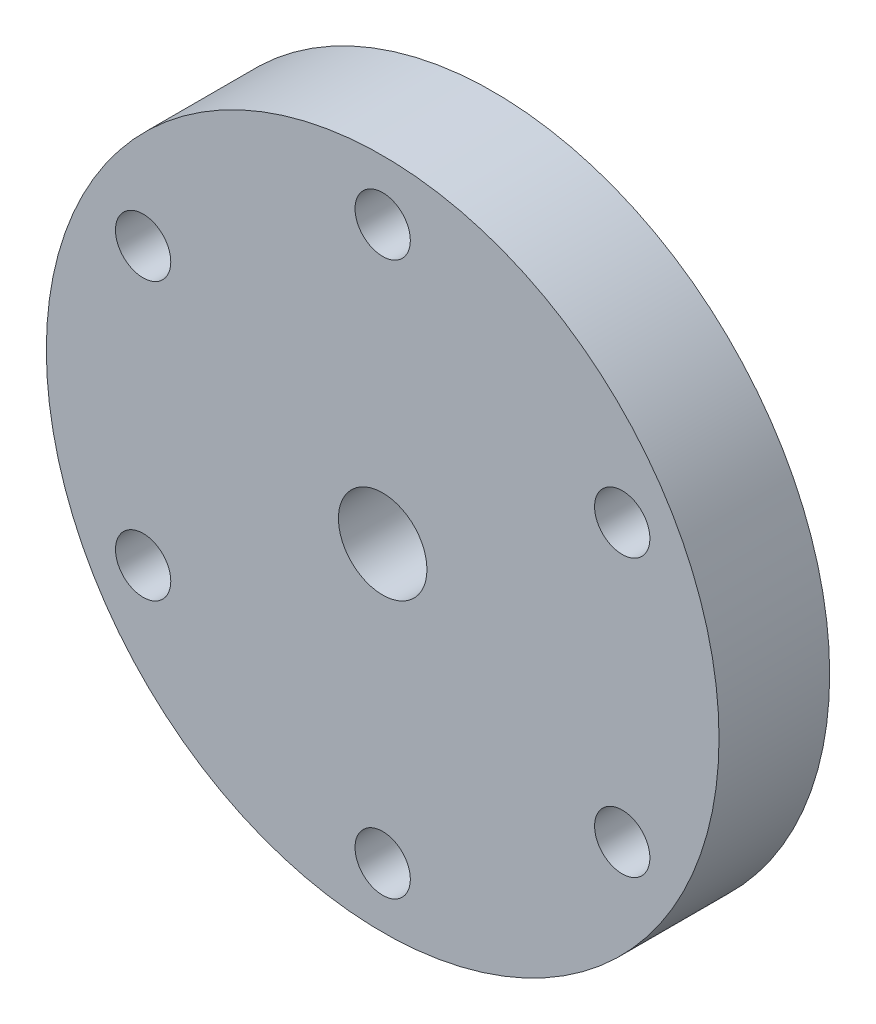
ISO-10303-21;
HEADER;
FILE_DESCRIPTION(('STEP AP214'),'2;1');
FILE_NAME('part.step','',(''),(''),'','','');
FILE_SCHEMA(('AUTOMOTIVE_DESIGN { 1 0 10303 214 1 1 1 1 }'));
ENDSEC;
DATA;
#1=APPLICATION_CONTEXT('core data for automotive mechanical design processes');
#2=APPLICATION_PROTOCOL_DEFINITION('international standard','automotive_design',2000,#1);
#3=PRODUCT_CONTEXT('',#1,'mechanical');
#4=PRODUCT('Part','Part','',(#3));
#5=PRODUCT_RELATED_PRODUCT_CATEGORY('part','',(#4));
#6=PRODUCT_DEFINITION_FORMATION('','',#4);
#7=PRODUCT_DEFINITION_CONTEXT('part definition',#1,'design');
#8=PRODUCT_DEFINITION('design','',#6,#7);
#9=PRODUCT_DEFINITION_SHAPE('','',#8);
#10=(LENGTH_UNIT() NAMED_UNIT(*) SI_UNIT(.MILLI.,.METRE.));
#11=(NAMED_UNIT(*) PLANE_ANGLE_UNIT() SI_UNIT($,.RADIAN.));
#12=(NAMED_UNIT(*) SI_UNIT($,.STERADIAN.) SOLID_ANGLE_UNIT());
#13=UNCERTAINTY_MEASURE_WITH_UNIT(LENGTH_MEASURE(1.E-05),#10,'distance_accuracy_value','');
#14=(GEOMETRIC_REPRESENTATION_CONTEXT(3) GLOBAL_UNCERTAINTY_ASSIGNED_CONTEXT((#13)) GLOBAL_UNIT_ASSIGNED_CONTEXT((#10,
#11,#12)) REPRESENTATION_CONTEXT('',''));
#15=CARTESIAN_POINT('',(0.,0.,0.));
#16=DIRECTION('',(0.,0.,1.));
#17=DIRECTION('',(1.,0.,0.));
#18=AXIS2_PLACEMENT_3D('',#15,#16,#17);
#19=CARTESIAN_POINT('',(0.,0.,5.));
#20=DIRECTION('',(0.,0.,-1.));
#21=DIRECTION('',(-1.,0.,0.));
#22=AXIS2_PLACEMENT_3D('',#19,#20,#21);
#23=CYLINDRICAL_SURFACE('',#22,15.2);
#24=CARTESIAN_POINT('',(0.,0.,5.));
#25=DIRECTION('',(0.,0.,1.));
#26=DIRECTION('',(1.,0.,0.));
#27=AXIS2_PLACEMENT_3D('',#24,#25,#26);
#28=CIRCLE('',#27,15.2);
#29=CARTESIAN_POINT('',(15.2,0.,5.));
#30=VERTEX_POINT('',#29);
#31=EDGE_CURVE('E10',#30,#30,#28,.T.);
#32=ORIENTED_EDGE('',*,*,#31,.F.);
#33=EDGE_LOOP('',(#32));
#34=FACE_BOUND('',#33,.T.);
#35=CARTESIAN_POINT('',(0.,0.,0.));
#36=DIRECTION('',(0.,0.,1.));
#37=DIRECTION('',(1.,0.,0.));
#38=AXIS2_PLACEMENT_3D('',#35,#36,#37);
#39=CIRCLE('',#38,15.2);
#40=CARTESIAN_POINT('',(15.2,0.,0.));
#41=VERTEX_POINT('',#40);
#42=EDGE_CURVE('E50',#41,#41,#39,.T.);
#43=ORIENTED_EDGE('',*,*,#42,.T.);
#44=EDGE_LOOP('',(#43));
#45=FACE_BOUND('',#44,.T.);
#46=ADVANCED_FACE('F47',(#34,#45),#23,.T.);
#47=CARTESIAN_POINT('',(0.,0.,5.));
#48=DIRECTION('',(0.,0.,1.));
#49=DIRECTION('',(1.,0.,0.));
#50=AXIS2_PLACEMENT_3D('',#47,#48,#49);
#51=PLANE('',#50);
#52=CARTESIAN_POINT('',(0.,0.,5.));
#53=DIRECTION('',(0.,0.,1.));
#54=DIRECTION('',(1.,0.,0.));
#55=AXIS2_PLACEMENT_3D('',#52,#53,#54);
#56=CIRCLE('',#55,2.);
#57=CARTESIAN_POINT('',(2.,0.,5.));
#58=VERTEX_POINT('',#57);
#59=EDGE_CURVE('E106',#58,#58,#56,.T.);
#60=ORIENTED_EDGE('',*,*,#59,.F.);
#61=EDGE_LOOP('',(#60));
#62=FACE_BOUND('',#61,.T.);
#63=CARTESIAN_POINT('',(0.,12.5,5.));
#64=DIRECTION('',(0.,0.,1.));
#65=DIRECTION('',(1.,0.,0.));
#66=AXIS2_PLACEMENT_3D('',#63,#64,#65);
#67=CIRCLE('',#66,1.25);
#68=CARTESIAN_POINT('',(1.25,12.5,5.));
#69=VERTEX_POINT('',#68);
#70=EDGE_CURVE('E61',#69,#69,#67,.T.);
#71=ORIENTED_EDGE('',*,*,#70,.F.);
#72=EDGE_LOOP('',(#71));
#73=FACE_BOUND('',#72,.T.);
#74=CARTESIAN_POINT('',(-10.8253175473055,6.25,5.));
#75=DIRECTION('',(0.,0.,1.));
#76=DIRECTION('',(1.,0.,0.));
#77=AXIS2_PLACEMENT_3D('',#74,#75,#76);
#78=CIRCLE('',#77,1.25);
#79=CARTESIAN_POINT('',(-9.57531754730548,6.25,5.));
#80=VERTEX_POINT('',#79);
#81=EDGE_CURVE('E66',#80,#80,#78,.T.);
#82=ORIENTED_EDGE('',*,*,#81,.F.);
#83=EDGE_LOOP('',(#82));
#84=FACE_BOUND('',#83,.T.);
#85=CARTESIAN_POINT('',(-10.8253175473055,-6.25000000000001,5.));
#86=DIRECTION('',(0.,0.,1.));
#87=DIRECTION('',(1.,0.,0.));
#88=AXIS2_PLACEMENT_3D('',#85,#86,#87);
#89=CIRCLE('',#88,1.25);
#90=CARTESIAN_POINT('',(-9.57531754730548,-6.25000000000001,5.));
#91=VERTEX_POINT('',#90);
#92=EDGE_CURVE('E70',#91,#91,#89,.T.);
#93=ORIENTED_EDGE('',*,*,#92,.F.);
#94=EDGE_LOOP('',(#93));
#95=FACE_BOUND('',#94,.T.);
#96=CARTESIAN_POINT('',(0.,-12.5,5.));
#97=DIRECTION('',(0.,0.,1.));
#98=DIRECTION('',(1.,0.,0.));
#99=AXIS2_PLACEMENT_3D('',#96,#97,#98);
#100=CIRCLE('',#99,1.25);
#101=CARTESIAN_POINT('',(1.25,-12.5,5.));
#102=VERTEX_POINT('',#101);
#103=EDGE_CURVE('E73',#102,#102,#100,.T.);
#104=ORIENTED_EDGE('',*,*,#103,.F.);
#105=EDGE_LOOP('',(#104));
#106=FACE_BOUND('',#105,.T.);
#107=CARTESIAN_POINT('',(10.8253175473055,-6.25,5.));
#108=DIRECTION('',(0.,0.,1.));
#109=DIRECTION('',(1.,0.,0.));
#110=AXIS2_PLACEMENT_3D('',#107,#108,#109);
#111=CIRCLE('',#110,1.25);
#112=CARTESIAN_POINT('',(12.0753175473055,-6.25,5.));
#113=VERTEX_POINT('',#112);
#114=EDGE_CURVE('E77',#113,#113,#111,.T.);
#115=ORIENTED_EDGE('',*,*,#114,.F.);
#116=EDGE_LOOP('',(#115));
#117=FACE_BOUND('',#116,.T.);
#118=CARTESIAN_POINT('',(10.8253175473055,6.25,5.));
#119=DIRECTION('',(0.,0.,1.));
#120=DIRECTION('',(1.,0.,0.));
#121=AXIS2_PLACEMENT_3D('',#118,#119,#120);
#122=CIRCLE('',#121,1.25);
#123=CARTESIAN_POINT('',(12.0753175473055,6.25,5.));
#124=VERTEX_POINT('',#123);
#125=EDGE_CURVE('E81',#124,#124,#122,.T.);
#126=ORIENTED_EDGE('',*,*,#125,.F.);
#127=EDGE_LOOP('',(#126));
#128=FACE_BOUND('',#127,.T.);
#129=ORIENTED_EDGE('',*,*,#31,.T.);
#130=EDGE_LOOP('',(#129));
#131=FACE_BOUND('',#130,.T.);
#132=ADVANCED_FACE('F133',(#62,#73,#84,#95,#106,#117,#128,#131),#51,.T.);
#133=CARTESIAN_POINT('',(0.,0.,0.));
#134=DIRECTION('',(0.,0.,1.));
#135=DIRECTION('',(1.,0.,0.));
#136=AXIS2_PLACEMENT_3D('',#133,#134,#135);
#137=PLANE('',#136);
#138=CARTESIAN_POINT('',(0.,0.,0.));
#139=DIRECTION('',(0.,0.,1.));
#140=DIRECTION('',(1.,0.,0.));
#141=AXIS2_PLACEMENT_3D('',#138,#139,#140);
#142=CIRCLE('',#141,2.);
#143=CARTESIAN_POINT('',(2.,0.,0.));
#144=VERTEX_POINT('',#143);
#145=EDGE_CURVE('E113',#144,#144,#142,.T.);
#146=ORIENTED_EDGE('',*,*,#145,.T.);
#147=EDGE_LOOP('',(#146));
#148=FACE_BOUND('',#147,.T.);
#149=CARTESIAN_POINT('',(0.,12.5,0.));
#150=DIRECTION('',(0.,0.,1.));
#151=DIRECTION('',(1.,0.,0.));
#152=AXIS2_PLACEMENT_3D('',#149,#150,#151);
#153=CIRCLE('',#152,1.25);
#154=CARTESIAN_POINT('',(1.25,12.5,0.));
#155=VERTEX_POINT('',#154);
#156=EDGE_CURVE('E85',#155,#155,#153,.T.);
#157=ORIENTED_EDGE('',*,*,#156,.T.);
#158=EDGE_LOOP('',(#157));
#159=FACE_BOUND('',#158,.T.);
#160=CARTESIAN_POINT('',(-10.8253175473055,6.25,0.));
#161=DIRECTION('',(0.,0.,1.));
#162=DIRECTION('',(1.,0.,0.));
#163=AXIS2_PLACEMENT_3D('',#160,#161,#162);
#164=CIRCLE('',#163,1.25);
#165=CARTESIAN_POINT('',(-9.57531754730548,6.25,0.));
#166=VERTEX_POINT('',#165);
#167=EDGE_CURVE('E91',#166,#166,#164,.T.);
#168=ORIENTED_EDGE('',*,*,#167,.T.);
#169=EDGE_LOOP('',(#168));
#170=FACE_BOUND('',#169,.T.);
#171=CARTESIAN_POINT('',(-10.8253175473055,-6.25000000000001,0.));
#172=DIRECTION('',(0.,0.,1.));
#173=DIRECTION('',(1.,0.,0.));
#174=AXIS2_PLACEMENT_3D('',#171,#172,#173);
#175=CIRCLE('',#174,1.25);
#176=CARTESIAN_POINT('',(-9.57531754730548,-6.25000000000001,0.));
#177=VERTEX_POINT('',#176);
#178=EDGE_CURVE('E86',#177,#177,#175,.T.);
#179=ORIENTED_EDGE('',*,*,#178,.T.);
#180=EDGE_LOOP('',(#179));
#181=FACE_BOUND('',#180,.T.);
#182=CARTESIAN_POINT('',(0.,-12.5,0.));
#183=DIRECTION('',(0.,0.,1.));
#184=DIRECTION('',(1.,0.,0.));
#185=AXIS2_PLACEMENT_3D('',#182,#183,#184);
#186=CIRCLE('',#185,1.25);
#187=CARTESIAN_POINT('',(1.25,-12.5,0.));
#188=VERTEX_POINT('',#187);
#189=EDGE_CURVE('E90',#188,#188,#186,.T.);
#190=ORIENTED_EDGE('',*,*,#189,.T.);
#191=EDGE_LOOP('',(#190));
#192=FACE_BOUND('',#191,.T.);
#193=CARTESIAN_POINT('',(10.8253175473055,-6.25,0.));
#194=DIRECTION('',(0.,0.,1.));
#195=DIRECTION('',(1.,0.,0.));
#196=AXIS2_PLACEMENT_3D('',#193,#194,#195);
#197=CIRCLE('',#196,1.25);
#198=CARTESIAN_POINT('',(12.0753175473055,-6.25,0.));
#199=VERTEX_POINT('',#198);
#200=EDGE_CURVE('E95',#199,#199,#197,.T.);
#201=ORIENTED_EDGE('',*,*,#200,.T.);
#202=EDGE_LOOP('',(#201));
#203=FACE_BOUND('',#202,.T.);
#204=CARTESIAN_POINT('',(10.8253175473055,6.25,0.));
#205=DIRECTION('',(0.,0.,1.));
#206=DIRECTION('',(1.,0.,0.));
#207=AXIS2_PLACEMENT_3D('',#204,#205,#206);
#208=CIRCLE('',#207,1.25);
#209=CARTESIAN_POINT('',(12.0753175473055,6.25,0.));
#210=VERTEX_POINT('',#209);
#211=EDGE_CURVE('E99',#210,#210,#208,.T.);
#212=ORIENTED_EDGE('',*,*,#211,.T.);
#213=EDGE_LOOP('',(#212));
#214=FACE_BOUND('',#213,.T.);
#215=ORIENTED_EDGE('',*,*,#42,.F.);
#216=EDGE_LOOP('',(#215));
#217=FACE_BOUND('',#216,.T.);
#218=ADVANCED_FACE('F119',(#148,#159,#170,#181,#192,#203,#214,#217),#137,.F.);
#219=CARTESIAN_POINT('',(10.8253175473055,6.25,0.));
#220=DIRECTION('',(0.,0.,1.));
#221=DIRECTION('',(1.,0.,0.));
#222=AXIS2_PLACEMENT_3D('',#219,#220,#221);
#223=CYLINDRICAL_SURFACE('',#222,1.25);
#224=ORIENTED_EDGE('',*,*,#125,.T.);
#225=EDGE_LOOP('',(#224));
#226=FACE_BOUND('',#225,.T.);
#227=ORIENTED_EDGE('',*,*,#211,.F.);
#228=EDGE_LOOP('',(#227));
#229=FACE_BOUND('',#228,.T.);
#230=ADVANCED_FACE('F143',(#226,#229),#223,.F.);
#231=CARTESIAN_POINT('',(10.8253175473055,-6.25,0.));
#232=DIRECTION('',(0.,0.,1.));
#233=DIRECTION('',(1.,0.,0.));
#234=AXIS2_PLACEMENT_3D('',#231,#232,#233);
#235=CYLINDRICAL_SURFACE('',#234,1.25);
#236=ORIENTED_EDGE('',*,*,#114,.T.);
#237=EDGE_LOOP('',(#236));
#238=FACE_BOUND('',#237,.T.);
#239=ORIENTED_EDGE('',*,*,#200,.F.);
#240=EDGE_LOOP('',(#239));
#241=FACE_BOUND('',#240,.T.);
#242=ADVANCED_FACE('F146',(#238,#241),#235,.F.);
#243=CARTESIAN_POINT('',(0.,-12.5,0.));
#244=DIRECTION('',(0.,0.,1.));
#245=DIRECTION('',(1.,0.,0.));
#246=AXIS2_PLACEMENT_3D('',#243,#244,#245);
#247=CYLINDRICAL_SURFACE('',#246,1.25);
#248=ORIENTED_EDGE('',*,*,#103,.T.);
#249=EDGE_LOOP('',(#248));
#250=FACE_BOUND('',#249,.T.);
#251=ORIENTED_EDGE('',*,*,#189,.F.);
#252=EDGE_LOOP('',(#251));
#253=FACE_BOUND('',#252,.T.);
#254=ADVANCED_FACE('F153',(#250,#253),#247,.F.);
#255=CARTESIAN_POINT('',(-10.8253175473055,-6.25000000000001,0.));
#256=DIRECTION('',(0.,0.,1.));
#257=DIRECTION('',(1.,0.,0.));
#258=AXIS2_PLACEMENT_3D('',#255,#256,#257);
#259=CYLINDRICAL_SURFACE('',#258,1.25);
#260=ORIENTED_EDGE('',*,*,#92,.T.);
#261=EDGE_LOOP('',(#260));
#262=FACE_BOUND('',#261,.T.);
#263=ORIENTED_EDGE('',*,*,#178,.F.);
#264=EDGE_LOOP('',(#263));
#265=FACE_BOUND('',#264,.T.);
#266=ADVANCED_FACE('F150',(#262,#265),#259,.F.);
#267=CARTESIAN_POINT('',(-10.8253175473055,6.25,0.));
#268=DIRECTION('',(0.,0.,1.));
#269=DIRECTION('',(1.,0.,0.));
#270=AXIS2_PLACEMENT_3D('',#267,#268,#269);
#271=CYLINDRICAL_SURFACE('',#270,1.25);
#272=ORIENTED_EDGE('',*,*,#81,.T.);
#273=EDGE_LOOP('',(#272));
#274=FACE_BOUND('',#273,.T.);
#275=ORIENTED_EDGE('',*,*,#167,.F.);
#276=EDGE_LOOP('',(#275));
#277=FACE_BOUND('',#276,.T.);
#278=ADVANCED_FACE('F129',(#274,#277),#271,.F.);
#279=CARTESIAN_POINT('',(0.,12.5,0.));
#280=DIRECTION('',(0.,0.,1.));
#281=DIRECTION('',(1.,0.,0.));
#282=AXIS2_PLACEMENT_3D('',#279,#280,#281);
#283=CYLINDRICAL_SURFACE('',#282,1.25);
#284=ORIENTED_EDGE('',*,*,#70,.T.);
#285=EDGE_LOOP('',(#284));
#286=FACE_BOUND('',#285,.T.);
#287=ORIENTED_EDGE('',*,*,#156,.F.);
#288=EDGE_LOOP('',(#287));
#289=FACE_BOUND('',#288,.T.);
#290=ADVANCED_FACE('F124',(#286,#289),#283,.F.);
#291=CARTESIAN_POINT('',(0.,0.,0.));
#292=DIRECTION('',(0.,0.,1.));
#293=DIRECTION('',(1.,0.,0.));
#294=AXIS2_PLACEMENT_3D('',#291,#292,#293);
#295=CYLINDRICAL_SURFACE('',#294,2.);
#296=ORIENTED_EDGE('',*,*,#59,.T.);
#297=EDGE_LOOP('',(#296));
#298=FACE_BOUND('',#297,.T.);
#299=ORIENTED_EDGE('',*,*,#145,.F.);
#300=EDGE_LOOP('',(#299));
#301=FACE_BOUND('',#300,.T.);
#302=ADVANCED_FACE('F122',(#298,#301),#295,.F.);
#303=CLOSED_SHELL('',(#46,#132,#218,#230,#242,#254,#266,#278,#290,#302));
#304=MANIFOLD_SOLID_BREP('B2',#303);
#305=ADVANCED_BREP_SHAPE_REPRESENTATION('',(#18,#304),#14);
#306=SHAPE_DEFINITION_REPRESENTATION(#9,#305);
ENDSEC;
END-ISO-10303-21;
